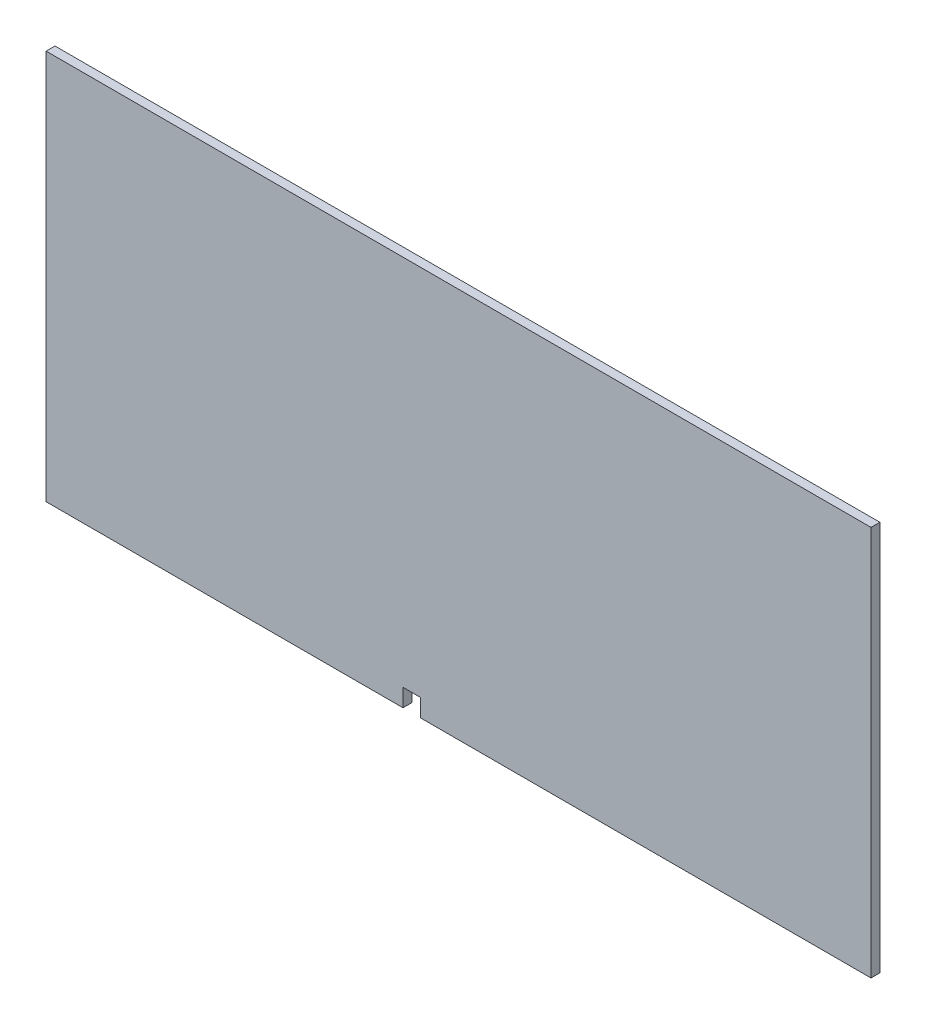
ISO-10303-21;
HEADER;
FILE_DESCRIPTION(('STEP AP214'),'2;1');
FILE_NAME('part.step','',(''),(''),'','','');
FILE_SCHEMA(('AUTOMOTIVE_DESIGN { 1 0 10303 214 1 1 1 1 }'));
ENDSEC;
DATA;
#1=APPLICATION_CONTEXT('core data for automotive mechanical design processes');
#2=APPLICATION_PROTOCOL_DEFINITION('international standard','automotive_design',2000,#1);
#3=PRODUCT_CONTEXT('',#1,'mechanical');
#4=PRODUCT('Part','Part','',(#3));
#5=PRODUCT_RELATED_PRODUCT_CATEGORY('part','',(#4));
#6=PRODUCT_DEFINITION_FORMATION('','',#4);
#7=PRODUCT_DEFINITION_CONTEXT('part definition',#1,'design');
#8=PRODUCT_DEFINITION('design','',#6,#7);
#9=PRODUCT_DEFINITION_SHAPE('','',#8);
#10=(LENGTH_UNIT() NAMED_UNIT(*) SI_UNIT(.MILLI.,.METRE.));
#11=(NAMED_UNIT(*) PLANE_ANGLE_UNIT() SI_UNIT($,.RADIAN.));
#12=(NAMED_UNIT(*) SI_UNIT($,.STERADIAN.) SOLID_ANGLE_UNIT());
#13=UNCERTAINTY_MEASURE_WITH_UNIT(LENGTH_MEASURE(1.E-05),#10,'distance_accuracy_value','');
#14=(GEOMETRIC_REPRESENTATION_CONTEXT(3) GLOBAL_UNCERTAINTY_ASSIGNED_CONTEXT((#13)) GLOBAL_UNIT_ASSIGNED_CONTEXT((#10,
#11,#12)) REPRESENTATION_CONTEXT('',''));
#15=CARTESIAN_POINT('',(0.,0.,0.));
#16=DIRECTION('',(0.,0.,1.));
#17=DIRECTION('',(1.,0.,0.));
#18=AXIS2_PLACEMENT_3D('',#15,#16,#17);
#19=CARTESIAN_POINT('',(-232.5,-110.,5.));
#20=DIRECTION('',(0.,1.,0.));
#21=DIRECTION('',(0.,0.,1.));
#22=AXIS2_PLACEMENT_3D('',#19,#20,#21);
#23=PLANE('',#22);
#24=DIRECTION('',(1.,0.,0.));
#25=VECTOR('',#24,1.);
#26=CARTESIAN_POINT('',(-232.5,-110.,0.));
#27=LINE('',#26,#25);
#28=CARTESIAN_POINT('',(-232.5,-110.,0.));
#29=VERTEX_POINT('',#28);
#30=CARTESIAN_POINT('',(-31.3269523013773,-110.,0.));
#31=VERTEX_POINT('',#30);
#32=EDGE_CURVE('E125',#29,#31,#27,.T.);
#33=ORIENTED_EDGE('',*,*,#32,.T.);
#34=DIRECTION('',(0.,0.,1.));
#35=VECTOR('',#34,1.);
#36=CARTESIAN_POINT('',(-31.3269523013773,-110.,-5.));
#37=LINE('',#36,#35);
#38=CARTESIAN_POINT('',(-31.3269523013773,-110.,5.));
#39=VERTEX_POINT('',#38);
#40=EDGE_CURVE('E110',#31,#39,#37,.T.);
#41=ORIENTED_EDGE('',*,*,#40,.T.);
#42=DIRECTION('',(1.,0.,0.));
#43=VECTOR('',#42,1.);
#44=CARTESIAN_POINT('',(-232.5,-110.,5.));
#45=LINE('',#44,#43);
#46=CARTESIAN_POINT('',(-232.5,-110.,5.));
#47=VERTEX_POINT('',#46);
#48=EDGE_CURVE('E123',#47,#39,#45,.T.);
#49=ORIENTED_EDGE('',*,*,#48,.F.);
#50=DIRECTION('',(0.,0.,-1.));
#51=VECTOR('',#50,1.);
#52=CARTESIAN_POINT('',(-232.5,-110.,5.));
#53=LINE('',#52,#51);
#54=EDGE_CURVE('E135',#47,#29,#53,.T.);
#55=ORIENTED_EDGE('',*,*,#54,.T.);
#56=EDGE_LOOP('',(#33,#41,#49,#55));
#57=FACE_BOUND('',#56,.T.);
#58=ADVANCED_FACE('F33',(#57),#23,.F.);
#59=CARTESIAN_POINT('',(232.5,-110.,5.));
#60=DIRECTION('',(-1.,0.,0.));
#61=DIRECTION('',(0.,0.,1.));
#62=AXIS2_PLACEMENT_3D('',#59,#60,#61);
#63=PLANE('',#62);
#64=DIRECTION('',(0.,1.,0.));
#65=VECTOR('',#64,1.);
#66=CARTESIAN_POINT('',(232.5,-110.,0.));
#67=LINE('',#66,#65);
#68=CARTESIAN_POINT('',(232.5,-110.,0.));
#69=VERTEX_POINT('',#68);
#70=CARTESIAN_POINT('',(232.5,110.,0.));
#71=VERTEX_POINT('',#70);
#72=EDGE_CURVE('E140',#69,#71,#67,.T.);
#73=ORIENTED_EDGE('',*,*,#72,.T.);
#74=DIRECTION('',(0.,0.,-1.));
#75=VECTOR('',#74,1.);
#76=CARTESIAN_POINT('',(232.5,110.,5.));
#77=LINE('',#76,#75);
#78=CARTESIAN_POINT('',(232.5,110.,5.));
#79=VERTEX_POINT('',#78);
#80=EDGE_CURVE('E153',#79,#71,#77,.T.);
#81=ORIENTED_EDGE('',*,*,#80,.F.);
#82=DIRECTION('',(0.,1.,0.));
#83=VECTOR('',#82,1.);
#84=CARTESIAN_POINT('',(232.5,-110.,5.));
#85=LINE('',#84,#83);
#86=CARTESIAN_POINT('',(232.5,-110.,5.));
#87=VERTEX_POINT('',#86);
#88=EDGE_CURVE('E147',#87,#79,#85,.T.);
#89=ORIENTED_EDGE('',*,*,#88,.F.);
#90=DIRECTION('',(0.,0.,-1.));
#91=VECTOR('',#90,1.);
#92=CARTESIAN_POINT('',(232.5,-110.,5.));
#93=LINE('',#92,#91);
#94=EDGE_CURVE('E133',#87,#69,#93,.T.);
#95=ORIENTED_EDGE('',*,*,#94,.T.);
#96=EDGE_LOOP('',(#73,#81,#89,#95));
#97=FACE_BOUND('',#96,.T.);
#98=ADVANCED_FACE('F35',(#97),#63,.F.);
#99=CARTESIAN_POINT('',(-232.5,110.,5.));
#100=DIRECTION('',(0.,-1.,0.));
#101=DIRECTION('',(0.,0.,-1.));
#102=AXIS2_PLACEMENT_3D('',#99,#100,#101);
#103=PLANE('',#102);
#104=DIRECTION('',(-1.,0.,0.));
#105=VECTOR('',#104,1.);
#106=CARTESIAN_POINT('',(-232.5,110.,0.));
#107=LINE('',#106,#105);
#108=CARTESIAN_POINT('',(-232.5,110.,0.));
#109=VERTEX_POINT('',#108);
#110=EDGE_CURVE('E143',#71,#109,#107,.T.);
#111=ORIENTED_EDGE('',*,*,#110,.T.);
#112=DIRECTION('',(0.,0.,-1.));
#113=VECTOR('',#112,1.);
#114=CARTESIAN_POINT('',(-232.5,110.,5.));
#115=LINE('',#114,#113);
#116=CARTESIAN_POINT('',(-232.5,110.,5.));
#117=VERTEX_POINT('',#116);
#118=EDGE_CURVE('E150',#117,#109,#115,.T.);
#119=ORIENTED_EDGE('',*,*,#118,.F.);
#120=DIRECTION('',(-1.,0.,0.));
#121=VECTOR('',#120,1.);
#122=CARTESIAN_POINT('',(-232.5,110.,5.));
#123=LINE('',#122,#121);
#124=EDGE_CURVE('E87',#79,#117,#123,.T.);
#125=ORIENTED_EDGE('',*,*,#124,.F.);
#126=ORIENTED_EDGE('',*,*,#80,.T.);
#127=EDGE_LOOP('',(#111,#119,#125,#126));
#128=FACE_BOUND('',#127,.T.);
#129=ADVANCED_FACE('F171',(#128),#103,.F.);
#130=CARTESIAN_POINT('',(-232.5,-110.,5.));
#131=DIRECTION('',(1.,0.,0.));
#132=DIRECTION('',(0.,0.,-1.));
#133=AXIS2_PLACEMENT_3D('',#130,#131,#132);
#134=PLANE('',#133);
#135=DIRECTION('',(0.,-1.,0.));
#136=VECTOR('',#135,1.);
#137=CARTESIAN_POINT('',(-232.5,-110.,0.));
#138=LINE('',#137,#136);
#139=EDGE_CURVE('E145',#109,#29,#138,.T.);
#140=ORIENTED_EDGE('',*,*,#139,.T.);
#141=ORIENTED_EDGE('',*,*,#54,.F.);
#142=DIRECTION('',(0.,-1.,0.));
#143=VECTOR('',#142,1.);
#144=CARTESIAN_POINT('',(-232.5,-110.,5.));
#145=LINE('',#144,#143);
#146=EDGE_CURVE('E131',#117,#47,#145,.T.);
#147=ORIENTED_EDGE('',*,*,#146,.F.);
#148=ORIENTED_EDGE('',*,*,#118,.T.);
#149=EDGE_LOOP('',(#140,#141,#147,#148));
#150=FACE_BOUND('',#149,.T.);
#151=ADVANCED_FACE('F174',(#150),#134,.F.);
#152=CARTESIAN_POINT('',(-21.3269523013773,-110.,5.));
#153=VERTEX_POINT('',#152);
#154=EDGE_CURVE('E57',#153,#87,#45,.T.);
#155=ORIENTED_EDGE('',*,*,#154,.F.);
#156=DIRECTION('',(0.,0.,1.));
#157=VECTOR('',#156,1.);
#158=CARTESIAN_POINT('',(-21.3269523013773,-110.,-5.));
#159=LINE('',#158,#157);
#160=CARTESIAN_POINT('',(-21.3269523013773,-110.,0.));
#161=VERTEX_POINT('',#160);
#162=EDGE_CURVE('E126',#161,#153,#159,.T.);
#163=ORIENTED_EDGE('',*,*,#162,.F.);
#164=EDGE_CURVE('E79',#161,#69,#27,.T.);
#165=ORIENTED_EDGE('',*,*,#164,.T.);
#166=ORIENTED_EDGE('',*,*,#94,.F.);
#167=EDGE_LOOP('',(#155,#163,#165,#166));
#168=FACE_BOUND('',#167,.T.);
#169=ADVANCED_FACE('F164',(#168),#23,.F.);
#170=CARTESIAN_POINT('',(0.,0.,5.));
#171=DIRECTION('',(0.,0.,-1.));
#172=DIRECTION('',(-1.,0.,0.));
#173=AXIS2_PLACEMENT_3D('',#170,#171,#172);
#174=PLANE('',#173);
#175=ORIENTED_EDGE('',*,*,#48,.T.);
#176=DIRECTION('',(0.,-1.,0.));
#177=VECTOR('',#176,1.);
#178=CARTESIAN_POINT('',(-31.3269523013773,-110.,5.));
#179=LINE('',#178,#177);
#180=CARTESIAN_POINT('',(-31.3269523013773,-100.,5.));
#181=VERTEX_POINT('',#180);
#182=EDGE_CURVE('E107',#181,#39,#179,.T.);
#183=ORIENTED_EDGE('',*,*,#182,.F.);
#184=DIRECTION('',(-1.,0.,0.));
#185=VECTOR('',#184,1.);
#186=CARTESIAN_POINT('',(-31.3269523013773,-100.,5.));
#187=LINE('',#186,#185);
#188=CARTESIAN_POINT('',(-21.3269523013773,-100.,5.));
#189=VERTEX_POINT('',#188);
#190=EDGE_CURVE('E127',#189,#181,#187,.T.);
#191=ORIENTED_EDGE('',*,*,#190,.F.);
#192=DIRECTION('',(0.,1.,0.));
#193=VECTOR('',#192,1.);
#194=CARTESIAN_POINT('',(-21.3269523013773,-110.,5.));
#195=LINE('',#194,#193);
#196=EDGE_CURVE('E117',#153,#189,#195,.T.);
#197=ORIENTED_EDGE('',*,*,#196,.F.);
#198=ORIENTED_EDGE('',*,*,#154,.T.);
#199=ORIENTED_EDGE('',*,*,#88,.T.);
#200=ORIENTED_EDGE('',*,*,#124,.T.);
#201=ORIENTED_EDGE('',*,*,#146,.T.);
#202=EDGE_LOOP('',(#175,#183,#191,#197,#198,#199,#200,#201));
#203=FACE_BOUND('',#202,.T.);
#204=ADVANCED_FACE('F129',(#203),#174,.F.);
#205=CARTESIAN_POINT('',(0.,0.,0.));
#206=DIRECTION('',(0.,0.,-1.));
#207=DIRECTION('',(-1.,0.,0.));
#208=AXIS2_PLACEMENT_3D('',#205,#206,#207);
#209=PLANE('',#208);
#210=DIRECTION('',(0.,1.,0.));
#211=VECTOR('',#210,1.);
#212=CARTESIAN_POINT('',(-31.3269523013773,0.,0.));
#213=LINE('',#212,#211);
#214=CARTESIAN_POINT('',(-31.3269523013773,-100.,0.));
#215=VERTEX_POINT('',#214);
#216=EDGE_CURVE('E11',#31,#215,#213,.T.);
#217=ORIENTED_EDGE('',*,*,#216,.F.);
#218=ORIENTED_EDGE('',*,*,#32,.F.);
#219=ORIENTED_EDGE('',*,*,#139,.F.);
#220=ORIENTED_EDGE('',*,*,#110,.F.);
#221=ORIENTED_EDGE('',*,*,#72,.F.);
#222=ORIENTED_EDGE('',*,*,#164,.F.);
#223=DIRECTION('',(0.,-1.,0.));
#224=VECTOR('',#223,1.);
#225=CARTESIAN_POINT('',(-21.3269523013773,0.,0.));
#226=LINE('',#225,#224);
#227=CARTESIAN_POINT('',(-21.3269523013773,-100.,0.));
#228=VERTEX_POINT('',#227);
#229=EDGE_CURVE('E155',#228,#161,#226,.T.);
#230=ORIENTED_EDGE('',*,*,#229,.F.);
#231=DIRECTION('',(1.,0.,0.));
#232=VECTOR('',#231,1.);
#233=CARTESIAN_POINT('',(0.,-100.,0.));
#234=LINE('',#233,#232);
#235=EDGE_CURVE('E41',#215,#228,#234,.T.);
#236=ORIENTED_EDGE('',*,*,#235,.F.);
#237=EDGE_LOOP('',(#217,#218,#219,#220,#221,#222,#230,#236));
#238=FACE_BOUND('',#237,.T.);
#239=ADVANCED_FACE('F161',(#238),#209,.T.);
#240=CARTESIAN_POINT('',(-31.3269523013773,-110.,-5.));
#241=DIRECTION('',(-1.,0.,0.));
#242=DIRECTION('',(0.,0.,1.));
#243=AXIS2_PLACEMENT_3D('',#240,#241,#242);
#244=PLANE('',#243);
#245=ORIENTED_EDGE('',*,*,#216,.T.);
#246=DIRECTION('',(0.,0.,1.));
#247=VECTOR('',#246,1.);
#248=CARTESIAN_POINT('',(-31.3269523013773,-100.,-5.));
#249=LINE('',#248,#247);
#250=EDGE_CURVE('E113',#215,#181,#249,.T.);
#251=ORIENTED_EDGE('',*,*,#250,.T.);
#252=ORIENTED_EDGE('',*,*,#182,.T.);
#253=ORIENTED_EDGE('',*,*,#40,.F.);
#254=EDGE_LOOP('',(#245,#251,#252,#253));
#255=FACE_BOUND('',#254,.T.);
#256=ADVANCED_FACE('F109',(#255),#244,.F.);
#257=CARTESIAN_POINT('',(-31.3269523013773,-100.,-5.));
#258=DIRECTION('',(0.,1.,0.));
#259=DIRECTION('',(0.,0.,1.));
#260=AXIS2_PLACEMENT_3D('',#257,#258,#259);
#261=PLANE('',#260);
#262=ORIENTED_EDGE('',*,*,#235,.T.);
#263=DIRECTION('',(0.,0.,1.));
#264=VECTOR('',#263,1.);
#265=CARTESIAN_POINT('',(-21.3269523013773,-100.,-5.));
#266=LINE('',#265,#264);
#267=EDGE_CURVE('E48',#228,#189,#266,.T.);
#268=ORIENTED_EDGE('',*,*,#267,.T.);
#269=ORIENTED_EDGE('',*,*,#190,.T.);
#270=ORIENTED_EDGE('',*,*,#250,.F.);
#271=EDGE_LOOP('',(#262,#268,#269,#270));
#272=FACE_BOUND('',#271,.T.);
#273=ADVANCED_FACE('F159',(#272),#261,.F.);
#274=CARTESIAN_POINT('',(-21.3269523013773,-110.,-5.));
#275=DIRECTION('',(1.,0.,0.));
#276=DIRECTION('',(0.,0.,-1.));
#277=AXIS2_PLACEMENT_3D('',#274,#275,#276);
#278=PLANE('',#277);
#279=ORIENTED_EDGE('',*,*,#229,.T.);
#280=ORIENTED_EDGE('',*,*,#162,.T.);
#281=ORIENTED_EDGE('',*,*,#196,.T.);
#282=ORIENTED_EDGE('',*,*,#267,.F.);
#283=EDGE_LOOP('',(#279,#280,#281,#282));
#284=FACE_BOUND('',#283,.T.);
#285=ADVANCED_FACE('F163',(#284),#278,.F.);
#286=CLOSED_SHELL('',(#58,#98,#129,#151,#169,#204,#239,#256,#273,#285));
#287=MANIFOLD_SOLID_BREP('B2',#286);
#288=ADVANCED_BREP_SHAPE_REPRESENTATION('',(#18,#287),#14);
#289=SHAPE_DEFINITION_REPRESENTATION(#9,#288);
ENDSEC;
END-ISO-10303-21;
